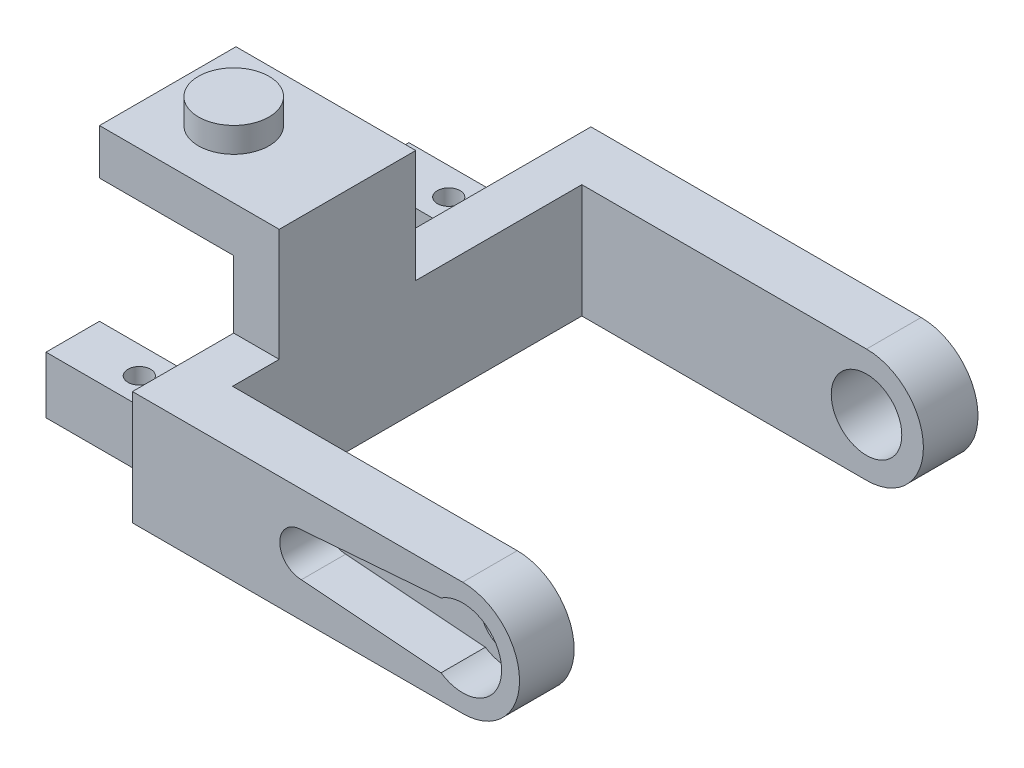
ISO-10303-21;
HEADER;
FILE_DESCRIPTION(('STEP AP214'),'2;1');
FILE_NAME('part.step','',(''),(''),'','','');
FILE_SCHEMA(('AUTOMOTIVE_DESIGN { 1 0 10303 214 1 1 1 1 }'));
ENDSEC;
DATA;
#1=APPLICATION_CONTEXT('core data for automotive mechanical design processes');
#2=APPLICATION_PROTOCOL_DEFINITION('international standard','automotive_design',2000,#1);
#3=PRODUCT_CONTEXT('',#1,'mechanical');
#4=PRODUCT('Part','Part','',(#3));
#5=PRODUCT_RELATED_PRODUCT_CATEGORY('part','',(#4));
#6=PRODUCT_DEFINITION_FORMATION('','',#4);
#7=PRODUCT_DEFINITION_CONTEXT('part definition',#1,'design');
#8=PRODUCT_DEFINITION('design','',#6,#7);
#9=PRODUCT_DEFINITION_SHAPE('','',#8);
#10=(LENGTH_UNIT() NAMED_UNIT(*) SI_UNIT(.MILLI.,.METRE.));
#11=(NAMED_UNIT(*) PLANE_ANGLE_UNIT() SI_UNIT($,.RADIAN.));
#12=(NAMED_UNIT(*) SI_UNIT($,.STERADIAN.) SOLID_ANGLE_UNIT());
#13=UNCERTAINTY_MEASURE_WITH_UNIT(LENGTH_MEASURE(1.E-05),#10,'distance_accuracy_value','');
#14=(GEOMETRIC_REPRESENTATION_CONTEXT(3) GLOBAL_UNCERTAINTY_ASSIGNED_CONTEXT((#13)) GLOBAL_UNIT_ASSIGNED_CONTEXT((#10,
#11,#12)) REPRESENTATION_CONTEXT('',''));
#15=CARTESIAN_POINT('',(0.,0.,0.));
#16=DIRECTION('',(0.,0.,1.));
#17=DIRECTION('',(1.,0.,0.));
#18=AXIS2_PLACEMENT_3D('',#15,#16,#17);
#19=CARTESIAN_POINT('',(-27.0232558139535,5.00000000000001,20.15));
#20=DIRECTION('',(0.,-1.,0.));
#21=DIRECTION('',(1.,0.,0.));
#22=AXIS2_PLACEMENT_3D('',#19,#20,#21);
#23=PLANE('',#22);
#24=DIRECTION('',(1.,0.,0.));
#25=VECTOR('',#24,1.);
#26=CARTESIAN_POINT('',(-2.,5.00000000000001,11.25));
#27=LINE('',#26,#25);
#28=CARTESIAN_POINT('',(-2.,5.00000000000001,11.25));
#29=VERTEX_POINT('',#28);
#30=CARTESIAN_POINT('',(2.,5.00000000000001,11.25));
#31=VERTEX_POINT('',#30);
#32=EDGE_CURVE('E558',#29,#31,#27,.T.);
#33=ORIENTED_EDGE('',*,*,#32,.F.);
#34=DIRECTION('',(0.,0.,1.));
#35=VECTOR('',#34,1.);
#36=CARTESIAN_POINT('',(-2.00000000000001,5.00000000000001,20.15));
#37=LINE('',#36,#35);
#38=CARTESIAN_POINT('',(-2.,5.00000000000002,20.15));
#39=VERTEX_POINT('',#38);
#40=EDGE_CURVE('E414',#29,#39,#37,.T.);
#41=ORIENTED_EDGE('',*,*,#40,.T.);
#42=DIRECTION('',(-1.,0.,0.));
#43=VECTOR('',#42,1.);
#44=CARTESIAN_POINT('',(-27.0232558139535,5.00000000000001,20.15));
#45=LINE('',#44,#43);
#46=CARTESIAN_POINT('',(27.0232558139535,5.00000000000002,20.15));
#47=VERTEX_POINT('',#46);
#48=EDGE_CURVE('E456',#47,#39,#45,.T.);
#49=ORIENTED_EDGE('',*,*,#48,.F.);
#50=DIRECTION('',(0.,0.,-1.));
#51=VECTOR('',#50,1.);
#52=CARTESIAN_POINT('',(27.0232558139535,5.00000000000002,20.15));
#53=LINE('',#52,#51);
#54=CARTESIAN_POINT('',(27.0232558139535,5.00000000000002,15.35));
#55=VERTEX_POINT('',#54);
#56=EDGE_CURVE('E471',#47,#55,#53,.T.);
#57=ORIENTED_EDGE('',*,*,#56,.T.);
#58=DIRECTION('',(-1.,0.,0.));
#59=VECTOR('',#58,1.);
#60=CARTESIAN_POINT('',(-27.0232558139535,5.00000000000001,15.35));
#61=LINE('',#60,#59);
#62=CARTESIAN_POINT('',(2.,5.00000000000001,15.35));
#63=VERTEX_POINT('',#62);
#64=EDGE_CURVE('E49',#55,#63,#61,.T.);
#65=ORIENTED_EDGE('',*,*,#64,.T.);
#66=DIRECTION('',(0.,0.,-1.));
#67=VECTOR('',#66,1.);
#68=CARTESIAN_POINT('',(1.99999999999999,5.00000000000001,20.15));
#69=LINE('',#68,#67);
#70=EDGE_CURVE('E481',#63,#31,#69,.T.);
#71=ORIENTED_EDGE('',*,*,#70,.T.);
#72=EDGE_LOOP('',(#33,#41,#49,#57,#65,#71));
#73=FACE_BOUND('',#72,.T.);
#74=ADVANCED_FACE('F39',(#73),#23,.F.);
#75=DIRECTION('',(-1.,0.,0.));
#76=VECTOR('',#75,1.);
#77=CARTESIAN_POINT('',(-2.,5.00000000000001,-0.750000000000002));
#78=LINE('',#77,#76);
#79=CARTESIAN_POINT('',(2.,5.00000000000001,-0.750000000000002));
#80=VERTEX_POINT('',#79);
#81=CARTESIAN_POINT('',(-2.,5.00000000000001,-0.750000000000001));
#82=VERTEX_POINT('',#81);
#83=EDGE_CURVE('E237',#80,#82,#78,.T.);
#84=ORIENTED_EDGE('',*,*,#83,.F.);
#85=CARTESIAN_POINT('',(2.,5.00000000000001,-15.35));
#86=VERTEX_POINT('',#85);
#87=EDGE_CURVE('E480',#80,#86,#69,.T.);
#88=ORIENTED_EDGE('',*,*,#87,.T.);
#89=DIRECTION('',(1.,0.,0.));
#90=VECTOR('',#89,1.);
#91=CARTESIAN_POINT('',(-27.0232558139535,5.00000000000001,-15.35));
#92=LINE('',#91,#90);
#93=CARTESIAN_POINT('',(27.0232558139535,5.00000000000002,-15.35));
#94=VERTEX_POINT('',#93);
#95=EDGE_CURVE('E11',#86,#94,#92,.T.);
#96=ORIENTED_EDGE('',*,*,#95,.T.);
#97=CARTESIAN_POINT('',(27.0232558139535,5.00000000000002,-20.15));
#98=VERTEX_POINT('',#97);
#99=EDGE_CURVE('E460',#94,#98,#53,.T.);
#100=ORIENTED_EDGE('',*,*,#99,.T.);
#101=DIRECTION('',(-1.,0.,0.));
#102=VECTOR('',#101,1.);
#103=CARTESIAN_POINT('',(-27.0232558139535,5.00000000000001,-20.15));
#104=LINE('',#103,#102);
#105=CARTESIAN_POINT('',(-2.,5.00000000000001,-20.15));
#106=VERTEX_POINT('',#105);
#107=EDGE_CURVE('E453',#98,#106,#104,.T.);
#108=ORIENTED_EDGE('',*,*,#107,.T.);
#109=EDGE_CURVE('E437',#106,#82,#37,.T.);
#110=ORIENTED_EDGE('',*,*,#109,.T.);
#111=EDGE_LOOP('',(#84,#88,#96,#100,#108,#110));
#112=FACE_BOUND('',#111,.T.);
#113=ADVANCED_FACE('F515',(#112),#23,.F.);
#114=CARTESIAN_POINT('',(27.0232558139535,0.,20.15));
#115=DIRECTION('',(0.,0.,-1.));
#116=DIRECTION('',(-1.,0.,0.));
#117=AXIS2_PLACEMENT_3D('',#114,#115,#116);
#118=CYLINDRICAL_SURFACE('',#117,5.00000000000002);
#119=ORIENTED_EDGE('',*,*,#99,.F.);
#120=CARTESIAN_POINT('',(27.0232558139535,0.,-15.35));
#121=DIRECTION('',(0.,0.,-1.));
#122=DIRECTION('',(-1.,0.,0.));
#123=AXIS2_PLACEMENT_3D('',#120,#121,#122);
#124=CIRCLE('',#123,5.00000000000002);
#125=CARTESIAN_POINT('',(27.0232558139535,-5.00000000000003,-15.35));
#126=VERTEX_POINT('',#125);
#127=EDGE_CURVE('E444',#94,#126,#124,.T.);
#128=ORIENTED_EDGE('',*,*,#127,.T.);
#129=DIRECTION('',(0.,0.,-1.));
#130=VECTOR('',#129,1.);
#131=CARTESIAN_POINT('',(27.0232558139535,-5.00000000000002,20.15));
#132=LINE('',#131,#130);
#133=CARTESIAN_POINT('',(27.0232558139535,-5.00000000000002,-20.15));
#134=VERTEX_POINT('',#133);
#135=EDGE_CURVE('E475',#126,#134,#132,.T.);
#136=ORIENTED_EDGE('',*,*,#135,.T.);
#137=CARTESIAN_POINT('',(27.0232558139535,0.,-20.15));
#138=DIRECTION('',(0.,0.,1.));
#139=DIRECTION('',(1.,0.,0.));
#140=AXIS2_PLACEMENT_3D('',#137,#138,#139);
#141=CIRCLE('',#140,5.00000000000002);
#142=EDGE_CURVE('E464',#134,#98,#141,.T.);
#143=ORIENTED_EDGE('',*,*,#142,.T.);
#144=EDGE_LOOP('',(#119,#128,#136,#143));
#145=FACE_BOUND('',#144,.T.);
#146=ADVANCED_FACE('F521',(#145),#118,.T.);
#147=CARTESIAN_POINT('',(-27.0232558139535,-5.00000000000002,20.15));
#148=DIRECTION('',(0.,1.,0.));
#149=DIRECTION('',(-1.,0.,0.));
#150=AXIS2_PLACEMENT_3D('',#147,#148,#149);
#151=PLANE('',#150);
#152=DIRECTION('',(1.,0.,0.));
#153=VECTOR('',#152,1.);
#154=CARTESIAN_POINT('',(-27.0232558139535,-5.00000000000002,20.15));
#155=LINE('',#154,#153);
#156=CARTESIAN_POINT('',(-2.,-5.00000000000003,20.15));
#157=VERTEX_POINT('',#156);
#158=CARTESIAN_POINT('',(27.0232558139535,-5.00000000000002,20.15));
#159=VERTEX_POINT('',#158);
#160=EDGE_CURVE('E449',#157,#159,#155,.T.);
#161=ORIENTED_EDGE('',*,*,#160,.F.);
#162=DIRECTION('',(0.,0.,-1.));
#163=VECTOR('',#162,1.);
#164=CARTESIAN_POINT('',(-2.,-5.00000000000003,20.15));
#165=LINE('',#164,#163);
#166=CARTESIAN_POINT('',(-1.99999999999999,-5.00000000000002,15.95));
#167=VERTEX_POINT('',#166);
#168=EDGE_CURVE('E403',#157,#167,#165,.T.);
#169=ORIENTED_EDGE('',*,*,#168,.T.);
#170=DIRECTION('',(-1.,0.,0.));
#171=VECTOR('',#170,1.);
#172=CARTESIAN_POINT('',(-2.,-5.00000000000002,15.95));
#173=LINE('',#172,#171);
#174=CARTESIAN_POINT('',(-13.8,-5.00000000000002,15.95));
#175=VERTEX_POINT('',#174);
#176=EDGE_CURVE('E257',#167,#175,#173,.T.);
#177=ORIENTED_EDGE('',*,*,#176,.T.);
#178=DIRECTION('',(0.,0.,-1.));
#179=VECTOR('',#178,1.);
#180=CARTESIAN_POINT('',(-13.8,-5.00000000000002,15.95));
#181=LINE('',#180,#179);
#182=CARTESIAN_POINT('',(-13.8,-5.00000000000002,11.25));
#183=VERTEX_POINT('',#182);
#184=EDGE_CURVE('E261',#175,#183,#181,.T.);
#185=ORIENTED_EDGE('',*,*,#184,.T.);
#186=DIRECTION('',(1.,0.,0.));
#187=VECTOR('',#186,1.);
#188=CARTESIAN_POINT('',(-13.8,-5.00000000000002,11.25));
#189=LINE('',#188,#187);
#190=CARTESIAN_POINT('',(-2.,-5.00000000000003,11.25));
#191=VERTEX_POINT('',#190);
#192=EDGE_CURVE('E262',#183,#191,#189,.T.);
#193=ORIENTED_EDGE('',*,*,#192,.T.);
#194=CARTESIAN_POINT('',(-2.,-5.00000000000003,-11.25));
#195=VERTEX_POINT('',#194);
#196=EDGE_CURVE('E408',#191,#195,#165,.T.);
#197=ORIENTED_EDGE('',*,*,#196,.T.);
#198=DIRECTION('',(-1.,0.,0.));
#199=VECTOR('',#198,1.);
#200=CARTESIAN_POINT('',(-13.8,-5.00000000000002,-11.25));
#201=LINE('',#200,#199);
#202=CARTESIAN_POINT('',(-13.8,-5.00000000000002,-11.25));
#203=VERTEX_POINT('',#202);
#204=EDGE_CURVE('E308',#195,#203,#201,.T.);
#205=ORIENTED_EDGE('',*,*,#204,.T.);
#206=DIRECTION('',(0.,0.,-1.));
#207=VECTOR('',#206,1.);
#208=CARTESIAN_POINT('',(-13.8,-5.00000000000002,-15.95));
#209=LINE('',#208,#207);
#210=CARTESIAN_POINT('',(-13.8,-5.00000000000002,-15.95));
#211=VERTEX_POINT('',#210);
#212=EDGE_CURVE('E309',#203,#211,#209,.T.);
#213=ORIENTED_EDGE('',*,*,#212,.T.);
#214=DIRECTION('',(1.,0.,0.));
#215=VECTOR('',#214,1.);
#216=CARTESIAN_POINT('',(-2.,-5.00000000000002,-15.95));
#217=LINE('',#216,#215);
#218=CARTESIAN_POINT('',(-2.,-5.00000000000003,-15.95));
#219=VERTEX_POINT('',#218);
#220=EDGE_CURVE('E303',#211,#219,#217,.T.);
#221=ORIENTED_EDGE('',*,*,#220,.T.);
#222=CARTESIAN_POINT('',(-2.,-5.00000000000003,-20.15));
#223=VERTEX_POINT('',#222);
#224=EDGE_CURVE('E409',#219,#223,#165,.T.);
#225=ORIENTED_EDGE('',*,*,#224,.T.);
#226=DIRECTION('',(1.,0.,0.));
#227=VECTOR('',#226,1.);
#228=CARTESIAN_POINT('',(-27.0232558139535,-5.00000000000002,-20.15));
#229=LINE('',#228,#227);
#230=EDGE_CURVE('E448',#223,#134,#229,.T.);
#231=ORIENTED_EDGE('',*,*,#230,.T.);
#232=ORIENTED_EDGE('',*,*,#135,.F.);
#233=DIRECTION('',(-1.,0.,0.));
#234=VECTOR('',#233,1.);
#235=CARTESIAN_POINT('',(27.0232558139535,-5.00000000000003,-15.35));
#236=LINE('',#235,#234);
#237=CARTESIAN_POINT('',(2.,-5.00000000000003,-15.35));
#238=VERTEX_POINT('',#237);
#239=EDGE_CURVE('E393',#126,#238,#236,.T.);
#240=ORIENTED_EDGE('',*,*,#239,.T.);
#241=DIRECTION('',(0.,0.,1.));
#242=VECTOR('',#241,1.);
#243=CARTESIAN_POINT('',(2.,-5.00000000000003,-15.35));
#244=LINE('',#243,#242);
#245=CARTESIAN_POINT('',(2.,-5.00000000000003,15.35));
#246=VERTEX_POINT('',#245);
#247=EDGE_CURVE('E421',#238,#246,#244,.T.);
#248=ORIENTED_EDGE('',*,*,#247,.T.);
#249=DIRECTION('',(1.,0.,0.));
#250=VECTOR('',#249,1.);
#251=CARTESIAN_POINT('',(2.,-5.00000000000003,15.35));
#252=LINE('',#251,#250);
#253=CARTESIAN_POINT('',(27.0232558139535,-5.00000000000003,15.35));
#254=VERTEX_POINT('',#253);
#255=EDGE_CURVE('E425',#246,#254,#252,.T.);
#256=ORIENTED_EDGE('',*,*,#255,.T.);
#257=EDGE_CURVE('E476',#159,#254,#132,.T.);
#258=ORIENTED_EDGE('',*,*,#257,.F.);
#259=EDGE_LOOP('',(#161,#169,#177,#185,#193,#197,#205,#213,#221,#225,#231,#232,#240,#248,#256,#258));
#260=FACE_BOUND('',#259,.T.);
#261=CARTESIAN_POINT('',(-7.9,-5.00000000000002,-13.55));
#262=DIRECTION('',(0.,1.,0.));
#263=DIRECTION('',(-1.,0.,0.));
#264=AXIS2_PLACEMENT_3D('',#261,#262,#263);
#265=CIRCLE('',#264,1.);
#266=CARTESIAN_POINT('',(-8.9,-5.00000000000002,-13.55));
#267=VERTEX_POINT('',#266);
#268=EDGE_CURVE('E307',#267,#267,#265,.F.);
#269=ORIENTED_EDGE('',*,*,#268,.F.);
#270=EDGE_LOOP('',(#269));
#271=FACE_BOUND('',#270,.T.);
#272=CARTESIAN_POINT('',(-7.9,-5.00000000000002,13.65));
#273=DIRECTION('',(0.,1.,0.));
#274=DIRECTION('',(-1.,0.,0.));
#275=AXIS2_PLACEMENT_3D('',#272,#273,#274);
#276=CIRCLE('',#275,1.);
#277=CARTESIAN_POINT('',(-8.9,-5.00000000000002,13.65));
#278=VERTEX_POINT('',#277);
#279=EDGE_CURVE('E260',#278,#278,#276,.F.);
#280=ORIENTED_EDGE('',*,*,#279,.F.);
#281=EDGE_LOOP('',(#280));
#282=FACE_BOUND('',#281,.T.);
#283=ADVANCED_FACE('F41',(#260,#271,#282),#151,.F.);
#284=ORIENTED_EDGE('',*,*,#257,.T.);
#285=CARTESIAN_POINT('',(27.0232558139535,0.,15.35));
#286=DIRECTION('',(0.,0.,1.));
#287=DIRECTION('',(1.,0.,0.));
#288=AXIS2_PLACEMENT_3D('',#285,#286,#287);
#289=CIRCLE('',#288,5.00000000000002);
#290=EDGE_CURVE('E440',#254,#55,#289,.T.);
#291=ORIENTED_EDGE('',*,*,#290,.T.);
#292=ORIENTED_EDGE('',*,*,#56,.F.);
#293=CARTESIAN_POINT('',(27.0232558139535,0.,20.15));
#294=DIRECTION('',(0.,0.,1.));
#295=DIRECTION('',(1.,0.,0.));
#296=AXIS2_PLACEMENT_3D('',#293,#294,#295);
#297=CIRCLE('',#296,5.00000000000002);
#298=EDGE_CURVE('E452',#159,#47,#297,.T.);
#299=ORIENTED_EDGE('',*,*,#298,.F.);
#300=EDGE_LOOP('',(#284,#291,#292,#299));
#301=FACE_BOUND('',#300,.T.);
#302=ADVANCED_FACE('F526',(#301),#118,.T.);
#303=CARTESIAN_POINT('',(-27.0232558139535,0.,20.15));
#304=DIRECTION('',(0.,0.,1.));
#305=DIRECTION('',(1.,0.,0.));
#306=AXIS2_PLACEMENT_3D('',#303,#304,#305);
#307=PLANE('',#306);
#308=CARTESIAN_POINT('',(12.8482558139535,0.,20.15));
#309=DIRECTION('',(0.,0.,1.));
#310=DIRECTION('',(1.,0.,0.));
#311=AXIS2_PLACEMENT_3D('',#308,#309,#310);
#312=CIRCLE('',#311,1.9);
#313=CARTESIAN_POINT('',(12.8482558139535,1.9,20.15));
#314=VERTEX_POINT('',#313);
#315=CARTESIAN_POINT('',(12.8482558139535,-1.9,20.15));
#316=VERTEX_POINT('',#315);
#317=EDGE_CURVE('E357',#314,#316,#312,.T.);
#318=ORIENTED_EDGE('',*,*,#317,.F.);
#319=DIRECTION('',(-0.997018781415782,-0.0771592476906667,0.));
#320=VECTOR('',#319,1.);
#321=CARTESIAN_POINT('',(25.1237492990923,2.85,20.15));
#322=LINE('',#321,#320);
#323=CARTESIAN_POINT('',(25.1237492990923,2.85,20.15));
#324=VERTEX_POINT('',#323);
#325=EDGE_CURVE('E364',#324,#314,#322,.T.);
#326=ORIENTED_EDGE('',*,*,#325,.F.);
#327=CARTESIAN_POINT('',(27.0232558139535,0.,20.15));
#328=DIRECTION('',(0.,0.,1.));
#329=DIRECTION('',(1.,0.,0.));
#330=AXIS2_PLACEMENT_3D('',#327,#328,#329);
#331=CIRCLE('',#330,3.425);
#332=CARTESIAN_POINT('',(25.1237492990923,-2.85,20.15));
#333=VERTEX_POINT('',#332);
#334=EDGE_CURVE('E383',#333,#324,#331,.T.);
#335=ORIENTED_EDGE('',*,*,#334,.F.);
#336=DIRECTION('',(0.997018781415782,-0.0771592476906667,0.));
#337=VECTOR('',#336,1.);
#338=CARTESIAN_POINT('',(12.8482558139535,-1.9,20.15));
#339=LINE('',#338,#337);
#340=EDGE_CURVE('E379',#316,#333,#339,.T.);
#341=ORIENTED_EDGE('',*,*,#340,.F.);
#342=EDGE_LOOP('',(#318,#326,#335,#341));
#343=FACE_BOUND('',#342,.T.);
#344=DIRECTION('',(0.,1.,0.));
#345=VECTOR('',#344,1.);
#346=CARTESIAN_POINT('',(-2.,-5.00000000000003,20.15));
#347=LINE('',#346,#345);
#348=EDGE_CURVE('E407',#157,#39,#347,.T.);
#349=ORIENTED_EDGE('',*,*,#348,.F.);
#350=ORIENTED_EDGE('',*,*,#160,.T.);
#351=ORIENTED_EDGE('',*,*,#298,.T.);
#352=ORIENTED_EDGE('',*,*,#48,.T.);
#353=EDGE_LOOP('',(#349,#350,#351,#352));
#354=FACE_BOUND('',#353,.T.);
#355=ADVANCED_FACE('F528',(#343,#354),#307,.T.);
#356=CARTESIAN_POINT('',(-27.0232558139535,0.,-20.15));
#357=DIRECTION('',(0.,0.,1.));
#358=DIRECTION('',(1.,0.,0.));
#359=AXIS2_PLACEMENT_3D('',#356,#357,#358);
#360=PLANE('',#359);
#361=CARTESIAN_POINT('',(27.0232558139535,0.,-20.15));
#362=DIRECTION('',(0.,0.,1.));
#363=DIRECTION('',(1.,0.,0.));
#364=AXIS2_PLACEMENT_3D('',#361,#362,#363);
#365=CIRCLE('',#364,3.1);
#366=CARTESIAN_POINT('',(30.1232558139535,0.,-20.15));
#367=VERTEX_POINT('',#366);
#368=EDGE_CURVE('E349',#367,#367,#365,.T.);
#369=ORIENTED_EDGE('',*,*,#368,.T.);
#370=EDGE_LOOP('',(#369));
#371=FACE_BOUND('',#370,.T.);
#372=ORIENTED_EDGE('',*,*,#230,.F.);
#373=DIRECTION('',(0.,1.,0.));
#374=VECTOR('',#373,1.);
#375=CARTESIAN_POINT('',(-2.,-5.00000000000003,-20.15));
#376=LINE('',#375,#374);
#377=EDGE_CURVE('E410',#223,#106,#376,.T.);
#378=ORIENTED_EDGE('',*,*,#377,.T.);
#379=ORIENTED_EDGE('',*,*,#107,.F.);
#380=ORIENTED_EDGE('',*,*,#142,.F.);
#381=EDGE_LOOP('',(#372,#378,#379,#380));
#382=FACE_BOUND('',#381,.T.);
#383=ADVANCED_FACE('F524',(#371,#382),#360,.F.);
#384=CARTESIAN_POINT('',(-2.,-5.00000000000003,20.15));
#385=DIRECTION('',(1.,0.,0.));
#386=DIRECTION('',(0.,1.,0.));
#387=AXIS2_PLACEMENT_3D('',#384,#385,#386);
#388=PLANE('',#387);
#389=DIRECTION('',(0.,-1.,0.));
#390=VECTOR('',#389,1.);
#391=CARTESIAN_POINT('',(-2.,14.9,11.25));
#392=LINE('',#391,#390);
#393=CARTESIAN_POINT('',(-2.,10.9,11.25));
#394=VERTEX_POINT('',#393);
#395=EDGE_CURVE('E57',#394,#29,#392,.T.);
#396=ORIENTED_EDGE('',*,*,#395,.F.);
#397=DIRECTION('',(0.,0.,-1.));
#398=VECTOR('',#397,1.);
#399=CARTESIAN_POINT('',(-2.,10.9,-0.750000000000002));
#400=LINE('',#399,#398);
#401=CARTESIAN_POINT('',(-2.,10.9,-0.750000000000002));
#402=VERTEX_POINT('',#401);
#403=EDGE_CURVE('E221',#394,#402,#400,.T.);
#404=ORIENTED_EDGE('',*,*,#403,.T.);
#405=DIRECTION('',(0.,-1.,0.));
#406=VECTOR('',#405,1.);
#407=CARTESIAN_POINT('',(-2.,14.9,-0.750000000000002));
#408=LINE('',#407,#406);
#409=EDGE_CURVE('E65',#402,#82,#408,.T.);
#410=ORIENTED_EDGE('',*,*,#409,.T.);
#411=ORIENTED_EDGE('',*,*,#109,.F.);
#412=ORIENTED_EDGE('',*,*,#377,.F.);
#413=ORIENTED_EDGE('',*,*,#224,.F.);
#414=DIRECTION('',(0.,1.,0.));
#415=VECTOR('',#414,1.);
#416=CARTESIAN_POINT('',(-2.,-17.7015747055237,-15.95));
#417=LINE('',#416,#415);
#418=CARTESIAN_POINT('',(-2.,0.,-15.95));
#419=VERTEX_POINT('',#418);
#420=EDGE_CURVE('E334',#219,#419,#417,.T.);
#421=ORIENTED_EDGE('',*,*,#420,.T.);
#422=DIRECTION('',(0.,0.,-1.));
#423=VECTOR('',#422,1.);
#424=CARTESIAN_POINT('',(-2.,0.,-11.25));
#425=LINE('',#424,#423);
#426=CARTESIAN_POINT('',(-2.,0.,-11.25));
#427=VERTEX_POINT('',#426);
#428=EDGE_CURVE('E318',#427,#419,#425,.T.);
#429=ORIENTED_EDGE('',*,*,#428,.F.);
#430=DIRECTION('',(0.,1.,0.));
#431=VECTOR('',#430,1.);
#432=CARTESIAN_POINT('',(-2.,-17.7015747055237,-11.25));
#433=LINE('',#432,#431);
#434=EDGE_CURVE('E312',#195,#427,#433,.T.);
#435=ORIENTED_EDGE('',*,*,#434,.F.);
#436=ORIENTED_EDGE('',*,*,#196,.F.);
#437=DIRECTION('',(0.,1.,0.));
#438=VECTOR('',#437,1.);
#439=CARTESIAN_POINT('',(-2.,-17.7015747055237,11.25));
#440=LINE('',#439,#438);
#441=CARTESIAN_POINT('',(-2.,0.,11.25));
#442=VERTEX_POINT('',#441);
#443=EDGE_CURVE('E290',#191,#442,#440,.T.);
#444=ORIENTED_EDGE('',*,*,#443,.T.);
#445=DIRECTION('',(0.,0.,-1.));
#446=VECTOR('',#445,1.);
#447=CARTESIAN_POINT('',(-2.,0.,11.25));
#448=LINE('',#447,#446);
#449=CARTESIAN_POINT('',(-1.99999999999999,0.,15.95));
#450=VERTEX_POINT('',#449);
#451=EDGE_CURVE('E280',#450,#442,#448,.T.);
#452=ORIENTED_EDGE('',*,*,#451,.F.);
#453=DIRECTION('',(0.,1.,0.));
#454=VECTOR('',#453,1.);
#455=CARTESIAN_POINT('',(-1.99999999999999,-17.7015747055237,15.95));
#456=LINE('',#455,#454);
#457=EDGE_CURVE('E294',#167,#450,#456,.T.);
#458=ORIENTED_EDGE('',*,*,#457,.F.);
#459=ORIENTED_EDGE('',*,*,#168,.F.);
#460=ORIENTED_EDGE('',*,*,#348,.T.);
#461=ORIENTED_EDGE('',*,*,#40,.F.);
#462=EDGE_LOOP('',(#396,#404,#410,#411,#412,#413,#421,#429,#435,#436,#444,#452,#458,#459,#460,#461));
#463=FACE_BOUND('',#462,.T.);
#464=ADVANCED_FACE('F228',(#463),#388,.F.);
#465=CARTESIAN_POINT('',(27.0232558139535,-5.00000000000003,-15.35));
#466=DIRECTION('',(0.,0.,-1.));
#467=DIRECTION('',(-1.,0.,0.));
#468=AXIS2_PLACEMENT_3D('',#465,#466,#467);
#469=PLANE('',#468);
#470=CARTESIAN_POINT('',(27.0232558139535,0.,-15.35));
#471=DIRECTION('',(0.,0.,-1.));
#472=DIRECTION('',(-1.,0.,0.));
#473=AXIS2_PLACEMENT_3D('',#470,#471,#472);
#474=CIRCLE('',#473,3.1);
#475=CARTESIAN_POINT('',(23.9232558139535,0.,-15.35));
#476=VERTEX_POINT('',#475);
#477=EDGE_CURVE('E43',#476,#476,#474,.T.);
#478=ORIENTED_EDGE('',*,*,#477,.T.);
#479=EDGE_LOOP('',(#478));
#480=FACE_BOUND('',#479,.T.);
#481=ORIENTED_EDGE('',*,*,#95,.F.);
#482=DIRECTION('',(0.,1.,0.));
#483=VECTOR('',#482,1.);
#484=CARTESIAN_POINT('',(2.,-5.00000000000003,-15.35));
#485=LINE('',#484,#483);
#486=EDGE_CURVE('E429',#238,#86,#485,.T.);
#487=ORIENTED_EDGE('',*,*,#486,.F.);
#488=ORIENTED_EDGE('',*,*,#239,.F.);
#489=ORIENTED_EDGE('',*,*,#127,.F.);
#490=EDGE_LOOP('',(#481,#487,#488,#489));
#491=FACE_BOUND('',#490,.T.);
#492=ADVANCED_FACE('F494',(#480,#491),#469,.F.);
#493=CARTESIAN_POINT('',(27.0232558139535,-5.00000000000003,15.35));
#494=DIRECTION('',(0.,0.,1.));
#495=DIRECTION('',(1.,0.,0.));
#496=AXIS2_PLACEMENT_3D('',#493,#494,#495);
#497=PLANE('',#496);
#498=CARTESIAN_POINT('',(27.0232558139535,0.,15.35));
#499=DIRECTION('',(0.,0.,1.));
#500=DIRECTION('',(1.,0.,0.));
#501=AXIS2_PLACEMENT_3D('',#498,#499,#500);
#502=CIRCLE('',#501,2.3);
#503=CARTESIAN_POINT('',(29.3232558139535,0.,15.35));
#504=VERTEX_POINT('',#503);
#505=EDGE_CURVE('E353',#504,#504,#502,.F.);
#506=ORIENTED_EDGE('',*,*,#505,.F.);
#507=EDGE_LOOP('',(#506));
#508=FACE_BOUND('',#507,.T.);
#509=ORIENTED_EDGE('',*,*,#255,.F.);
#510=DIRECTION('',(0.,1.,0.));
#511=VECTOR('',#510,1.);
#512=CARTESIAN_POINT('',(2.,-5.00000000000003,15.35));
#513=LINE('',#512,#511);
#514=EDGE_CURVE('E430',#246,#63,#513,.T.);
#515=ORIENTED_EDGE('',*,*,#514,.T.);
#516=ORIENTED_EDGE('',*,*,#64,.F.);
#517=ORIENTED_EDGE('',*,*,#290,.F.);
#518=EDGE_LOOP('',(#509,#515,#516,#517));
#519=FACE_BOUND('',#518,.T.);
#520=ADVANCED_FACE('F569',(#508,#519),#497,.F.);
#521=CARTESIAN_POINT('',(2.,-5.00000000000003,-15.35));
#522=DIRECTION('',(-1.,0.,0.));
#523=DIRECTION('',(0.,-1.,0.));
#524=AXIS2_PLACEMENT_3D('',#521,#522,#523);
#525=PLANE('',#524);
#526=ORIENTED_EDGE('',*,*,#514,.F.);
#527=ORIENTED_EDGE('',*,*,#247,.F.);
#528=ORIENTED_EDGE('',*,*,#486,.T.);
#529=ORIENTED_EDGE('',*,*,#87,.F.);
#530=DIRECTION('',(0.,-1.,0.));
#531=VECTOR('',#530,1.);
#532=CARTESIAN_POINT('',(2.,14.9,-0.750000000000002));
#533=LINE('',#532,#531);
#534=CARTESIAN_POINT('',(2.,14.9,-0.750000000000002));
#535=VERTEX_POINT('',#534);
#536=EDGE_CURVE('E239',#535,#80,#533,.T.);
#537=ORIENTED_EDGE('',*,*,#536,.F.);
#538=DIRECTION('',(0.,0.,-1.));
#539=VECTOR('',#538,1.);
#540=CARTESIAN_POINT('',(2.,14.9,11.25));
#541=LINE('',#540,#539);
#542=CARTESIAN_POINT('',(2.,14.9,11.25));
#543=VERTEX_POINT('',#542);
#544=EDGE_CURVE('E246',#543,#535,#541,.T.);
#545=ORIENTED_EDGE('',*,*,#544,.F.);
#546=DIRECTION('',(0.,-1.,0.));
#547=VECTOR('',#546,1.);
#548=CARTESIAN_POINT('',(2.,14.9,11.25));
#549=LINE('',#548,#547);
#550=EDGE_CURVE('E244',#543,#31,#549,.T.);
#551=ORIENTED_EDGE('',*,*,#550,.T.);
#552=ORIENTED_EDGE('',*,*,#70,.F.);
#553=EDGE_LOOP('',(#526,#527,#528,#529,#537,#545,#551,#552));
#554=FACE_BOUND('',#553,.T.);
#555=ADVANCED_FACE('F563',(#554),#525,.F.);
#556=CARTESIAN_POINT('',(12.8482558139535,0.,16.25));
#557=DIRECTION('',(0.,0.,1.));
#558=DIRECTION('',(1.,0.,0.));
#559=AXIS2_PLACEMENT_3D('',#556,#557,#558);
#560=CYLINDRICAL_SURFACE('',#559,1.9);
#561=ORIENTED_EDGE('',*,*,#317,.T.);
#562=DIRECTION('',(0.,0.,1.));
#563=VECTOR('',#562,1.);
#564=CARTESIAN_POINT('',(12.8482558139535,-1.9,16.25));
#565=LINE('',#564,#563);
#566=CARTESIAN_POINT('',(12.8482558139535,-1.9,16.25));
#567=VERTEX_POINT('',#566);
#568=EDGE_CURVE('E376',#567,#316,#565,.T.);
#569=ORIENTED_EDGE('',*,*,#568,.F.);
#570=CARTESIAN_POINT('',(12.8482558139535,0.,16.25));
#571=DIRECTION('',(0.,0.,1.));
#572=DIRECTION('',(1.,0.,0.));
#573=AXIS2_PLACEMENT_3D('',#570,#571,#572);
#574=CIRCLE('',#573,1.9);
#575=CARTESIAN_POINT('',(12.8482558139535,1.9,16.25));
#576=VERTEX_POINT('',#575);
#577=EDGE_CURVE('E359',#576,#567,#574,.T.);
#578=ORIENTED_EDGE('',*,*,#577,.F.);
#579=DIRECTION('',(0.,0.,1.));
#580=VECTOR('',#579,1.);
#581=CARTESIAN_POINT('',(12.8482558139535,1.9,16.25));
#582=LINE('',#581,#580);
#583=EDGE_CURVE('E390',#576,#314,#582,.T.);
#584=ORIENTED_EDGE('',*,*,#583,.T.);
#585=EDGE_LOOP('',(#561,#569,#578,#584));
#586=FACE_BOUND('',#585,.T.);
#587=ADVANCED_FACE('F704',(#586),#560,.F.);
#588=CARTESIAN_POINT('',(25.1237492990923,2.85,16.25));
#589=DIRECTION('',(-0.0771592476906667,0.997018781415782,0.));
#590=DIRECTION('',(-0.997018781415782,-0.0771592476906667,0.));
#591=AXIS2_PLACEMENT_3D('',#588,#589,#590);
#592=PLANE('',#591);
#593=ORIENTED_EDGE('',*,*,#325,.T.);
#594=ORIENTED_EDGE('',*,*,#583,.F.);
#595=DIRECTION('',(-0.997018781415782,-0.0771592476906667,0.));
#596=VECTOR('',#595,1.);
#597=CARTESIAN_POINT('',(25.1237492990923,2.85,16.25));
#598=LINE('',#597,#596);
#599=CARTESIAN_POINT('',(25.1237492990923,2.85,16.25));
#600=VERTEX_POINT('',#599);
#601=EDGE_CURVE('E372',#600,#576,#598,.T.);
#602=ORIENTED_EDGE('',*,*,#601,.F.);
#603=DIRECTION('',(0.,0.,1.));
#604=VECTOR('',#603,1.);
#605=CARTESIAN_POINT('',(25.1237492990923,2.85,16.25));
#606=LINE('',#605,#604);
#607=EDGE_CURVE('E394',#600,#324,#606,.T.);
#608=ORIENTED_EDGE('',*,*,#607,.T.);
#609=EDGE_LOOP('',(#593,#594,#602,#608));
#610=FACE_BOUND('',#609,.T.);
#611=ADVANCED_FACE('F897',(#610),#592,.F.);
#612=CARTESIAN_POINT('',(27.0232558139535,0.,16.25));
#613=DIRECTION('',(0.,0.,1.));
#614=DIRECTION('',(1.,0.,0.));
#615=AXIS2_PLACEMENT_3D('',#612,#613,#614);
#616=CYLINDRICAL_SURFACE('',#615,3.425);
#617=ORIENTED_EDGE('',*,*,#334,.T.);
#618=ORIENTED_EDGE('',*,*,#607,.F.);
#619=CARTESIAN_POINT('',(27.0232558139535,0.,16.25));
#620=DIRECTION('',(0.,0.,1.));
#621=DIRECTION('',(1.,0.,0.));
#622=AXIS2_PLACEMENT_3D('',#619,#620,#621);
#623=CIRCLE('',#622,3.425);
#624=CARTESIAN_POINT('',(25.1237492990923,-2.85,16.25));
#625=VERTEX_POINT('',#624);
#626=EDGE_CURVE('E368',#625,#600,#623,.T.);
#627=ORIENTED_EDGE('',*,*,#626,.F.);
#628=DIRECTION('',(0.,0.,1.));
#629=VECTOR('',#628,1.);
#630=CARTESIAN_POINT('',(25.1237492990923,-2.85,16.25));
#631=LINE('',#630,#629);
#632=EDGE_CURVE('E397',#625,#333,#631,.T.);
#633=ORIENTED_EDGE('',*,*,#632,.T.);
#634=EDGE_LOOP('',(#617,#618,#627,#633));
#635=FACE_BOUND('',#634,.T.);
#636=ADVANCED_FACE('F906',(#635),#616,.F.);
#637=CARTESIAN_POINT('',(12.8482558139535,-1.9,16.25));
#638=DIRECTION('',(-0.0771592476906667,-0.997018781415782,0.));
#639=DIRECTION('',(0.997018781415782,-0.0771592476906667,0.));
#640=AXIS2_PLACEMENT_3D('',#637,#638,#639);
#641=PLANE('',#640);
#642=ORIENTED_EDGE('',*,*,#340,.T.);
#643=ORIENTED_EDGE('',*,*,#632,.F.);
#644=DIRECTION('',(0.997018781415782,-0.0771592476906667,0.));
#645=VECTOR('',#644,1.);
#646=CARTESIAN_POINT('',(12.8482558139535,-1.9,16.25));
#647=LINE('',#646,#645);
#648=EDGE_CURVE('E363',#567,#625,#647,.T.);
#649=ORIENTED_EDGE('',*,*,#648,.F.);
#650=ORIENTED_EDGE('',*,*,#568,.T.);
#651=EDGE_LOOP('',(#642,#643,#649,#650));
#652=FACE_BOUND('',#651,.T.);
#653=ADVANCED_FACE('F845',(#652),#641,.F.);
#654=CARTESIAN_POINT('',(12.8482558139535,0.,16.25));
#655=DIRECTION('',(0.,0.,1.));
#656=DIRECTION('',(1.,0.,0.));
#657=AXIS2_PLACEMENT_3D('',#654,#655,#656);
#658=PLANE('',#657);
#659=CARTESIAN_POINT('',(27.0232558139535,0.,16.25));
#660=DIRECTION('',(0.,0.,1.));
#661=DIRECTION('',(1.,0.,0.));
#662=AXIS2_PLACEMENT_3D('',#659,#660,#661);
#663=CIRCLE('',#662,2.3);
#664=CARTESIAN_POINT('',(29.3232558139535,0.,16.25));
#665=VERTEX_POINT('',#664);
#666=EDGE_CURVE('E358',#665,#665,#663,.F.);
#667=ORIENTED_EDGE('',*,*,#666,.T.);
#668=EDGE_LOOP('',(#667));
#669=FACE_BOUND('',#668,.T.);
#670=ORIENTED_EDGE('',*,*,#577,.T.);
#671=ORIENTED_EDGE('',*,*,#648,.T.);
#672=ORIENTED_EDGE('',*,*,#626,.T.);
#673=ORIENTED_EDGE('',*,*,#601,.T.);
#674=EDGE_LOOP('',(#670,#671,#672,#673));
#675=FACE_BOUND('',#674,.T.);
#676=ADVANCED_FACE('F510',(#669,#675),#658,.T.);
#677=CARTESIAN_POINT('',(27.0232558139535,0.,20.15));
#678=DIRECTION('',(0.,0.,-1.));
#679=DIRECTION('',(-1.,0.,0.));
#680=AXIS2_PLACEMENT_3D('',#677,#678,#679);
#681=CYLINDRICAL_SURFACE('',#680,2.3);
#682=ORIENTED_EDGE('',*,*,#666,.F.);
#683=EDGE_LOOP('',(#682));
#684=FACE_BOUND('',#683,.T.);
#685=ORIENTED_EDGE('',*,*,#505,.T.);
#686=EDGE_LOOP('',(#685));
#687=FACE_BOUND('',#686,.T.);
#688=ADVANCED_FACE('F500',(#684,#687),#681,.F.);
#689=CARTESIAN_POINT('',(27.0232558139535,0.,-20.15));
#690=DIRECTION('',(0.,0.,1.));
#691=DIRECTION('',(1.,0.,0.));
#692=AXIS2_PLACEMENT_3D('',#689,#690,#691);
#693=CYLINDRICAL_SURFACE('',#692,3.1);
#694=ORIENTED_EDGE('',*,*,#368,.F.);
#695=EDGE_LOOP('',(#694));
#696=FACE_BOUND('',#695,.T.);
#697=ORIENTED_EDGE('',*,*,#477,.F.);
#698=EDGE_LOOP('',(#697));
#699=FACE_BOUND('',#698,.T.);
#700=ADVANCED_FACE('F497',(#696,#699),#693,.F.);
#701=CARTESIAN_POINT('',(-2.,-17.7015747055237,-15.95));
#702=DIRECTION('',(0.,0.,-1.));
#703=DIRECTION('',(-1.,0.,0.));
#704=AXIS2_PLACEMENT_3D('',#701,#702,#703);
#705=PLANE('',#704);
#706=ORIENTED_EDGE('',*,*,#220,.F.);
#707=DIRECTION('',(0.,1.,0.));
#708=VECTOR('',#707,1.);
#709=CARTESIAN_POINT('',(-13.8,-17.7015747055237,-15.95));
#710=LINE('',#709,#708);
#711=CARTESIAN_POINT('',(-13.8,0.,-15.95));
#712=VERTEX_POINT('',#711);
#713=EDGE_CURVE('E341',#211,#712,#710,.T.);
#714=ORIENTED_EDGE('',*,*,#713,.T.);
#715=DIRECTION('',(-1.,0.,0.));
#716=VECTOR('',#715,1.);
#717=CARTESIAN_POINT('',(-2.,0.,-15.95));
#718=LINE('',#717,#716);
#719=EDGE_CURVE('E322',#419,#712,#718,.T.);
#720=ORIENTED_EDGE('',*,*,#719,.F.);
#721=ORIENTED_EDGE('',*,*,#420,.F.);
#722=EDGE_LOOP('',(#706,#714,#720,#721));
#723=FACE_BOUND('',#722,.T.);
#724=ADVANCED_FACE('F499',(#723),#705,.T.);
#725=CARTESIAN_POINT('',(-13.8,-17.7015747055237,-15.95));
#726=DIRECTION('',(-1.,0.,0.));
#727=DIRECTION('',(0.,0.,1.));
#728=AXIS2_PLACEMENT_3D('',#725,#726,#727);
#729=PLANE('',#728);
#730=ORIENTED_EDGE('',*,*,#212,.F.);
#731=DIRECTION('',(0.,1.,0.));
#732=VECTOR('',#731,1.);
#733=CARTESIAN_POINT('',(-13.8,-17.7015747055237,-11.25));
#734=LINE('',#733,#732);
#735=CARTESIAN_POINT('',(-13.8,0.,-11.25));
#736=VERTEX_POINT('',#735);
#737=EDGE_CURVE('E338',#203,#736,#734,.T.);
#738=ORIENTED_EDGE('',*,*,#737,.T.);
#739=DIRECTION('',(0.,0.,1.));
#740=VECTOR('',#739,1.);
#741=CARTESIAN_POINT('',(-13.8,0.,-15.95));
#742=LINE('',#741,#740);
#743=EDGE_CURVE('E326',#712,#736,#742,.T.);
#744=ORIENTED_EDGE('',*,*,#743,.F.);
#745=ORIENTED_EDGE('',*,*,#713,.F.);
#746=EDGE_LOOP('',(#730,#738,#744,#745));
#747=FACE_BOUND('',#746,.T.);
#748=ADVANCED_FACE('F507',(#747),#729,.T.);
#749=CARTESIAN_POINT('',(-13.8,-17.7015747055237,-11.25));
#750=DIRECTION('',(0.,0.,1.));
#751=DIRECTION('',(1.,0.,0.));
#752=AXIS2_PLACEMENT_3D('',#749,#750,#751);
#753=PLANE('',#752);
#754=ORIENTED_EDGE('',*,*,#204,.F.);
#755=ORIENTED_EDGE('',*,*,#434,.T.);
#756=DIRECTION('',(1.,0.,0.));
#757=VECTOR('',#756,1.);
#758=CARTESIAN_POINT('',(-13.8,0.,-11.25));
#759=LINE('',#758,#757);
#760=EDGE_CURVE('E330',#736,#427,#759,.T.);
#761=ORIENTED_EDGE('',*,*,#760,.F.);
#762=ORIENTED_EDGE('',*,*,#737,.F.);
#763=EDGE_LOOP('',(#754,#755,#761,#762));
#764=FACE_BOUND('',#763,.T.);
#765=ADVANCED_FACE('F603',(#764),#753,.T.);
#766=CARTESIAN_POINT('',(0.,0.,0.));
#767=DIRECTION('',(0.,1.,0.));
#768=DIRECTION('',(0.,0.,1.));
#769=AXIS2_PLACEMENT_3D('',#766,#767,#768);
#770=PLANE('',#769);
#771=CARTESIAN_POINT('',(-7.9,0.,-13.55));
#772=DIRECTION('',(0.,1.,0.));
#773=DIRECTION('',(0.,0.,1.));
#774=AXIS2_PLACEMENT_3D('',#771,#772,#773);
#775=CIRCLE('',#774,1.);
#776=CARTESIAN_POINT('',(-7.9,0.,-12.55));
#777=VERTEX_POINT('',#776);
#778=EDGE_CURVE('E302',#777,#777,#775,.T.);
#779=ORIENTED_EDGE('',*,*,#778,.F.);
#780=EDGE_LOOP('',(#779));
#781=FACE_BOUND('',#780,.T.);
#782=ORIENTED_EDGE('',*,*,#428,.T.);
#783=ORIENTED_EDGE('',*,*,#719,.T.);
#784=ORIENTED_EDGE('',*,*,#743,.T.);
#785=ORIENTED_EDGE('',*,*,#760,.T.);
#786=EDGE_LOOP('',(#782,#783,#784,#785));
#787=FACE_BOUND('',#786,.T.);
#788=ADVANCED_FACE('F605',(#781,#787),#770,.T.);
#789=CARTESIAN_POINT('',(-7.9,-17.7015747055237,-13.55));
#790=DIRECTION('',(0.,1.,0.));
#791=DIRECTION('',(0.,0.,1.));
#792=AXIS2_PLACEMENT_3D('',#789,#790,#791);
#793=CYLINDRICAL_SURFACE('',#792,1.);
#794=ORIENTED_EDGE('',*,*,#268,.T.);
#795=EDGE_LOOP('',(#794));
#796=FACE_BOUND('',#795,.T.);
#797=ORIENTED_EDGE('',*,*,#778,.T.);
#798=EDGE_LOOP('',(#797));
#799=FACE_BOUND('',#798,.T.);
#800=ADVANCED_FACE('F608',(#796,#799),#793,.F.);
#801=CARTESIAN_POINT('',(-1.99999999999999,-17.7015747055237,15.95));
#802=DIRECTION('',(0.,0.,1.));
#803=DIRECTION('',(1.,0.,0.));
#804=AXIS2_PLACEMENT_3D('',#801,#802,#803);
#805=PLANE('',#804);
#806=ORIENTED_EDGE('',*,*,#176,.F.);
#807=ORIENTED_EDGE('',*,*,#457,.T.);
#808=DIRECTION('',(1.,0.,0.));
#809=VECTOR('',#808,1.);
#810=CARTESIAN_POINT('',(-1.99999999999999,0.,15.95));
#811=LINE('',#810,#809);
#812=CARTESIAN_POINT('',(-13.8,0.,15.95));
#813=VERTEX_POINT('',#812);
#814=EDGE_CURVE('E276',#813,#450,#811,.T.);
#815=ORIENTED_EDGE('',*,*,#814,.F.);
#816=DIRECTION('',(0.,1.,0.));
#817=VECTOR('',#816,1.);
#818=CARTESIAN_POINT('',(-13.8,-17.7015747055237,15.95));
#819=LINE('',#818,#817);
#820=EDGE_CURVE('E287',#175,#813,#819,.T.);
#821=ORIENTED_EDGE('',*,*,#820,.F.);
#822=EDGE_LOOP('',(#806,#807,#815,#821));
#823=FACE_BOUND('',#822,.T.);
#824=ADVANCED_FACE('F581',(#823),#805,.T.);
#825=CARTESIAN_POINT('',(-13.8,-17.7015747055237,11.25));
#826=DIRECTION('',(0.,0.,-1.));
#827=DIRECTION('',(-1.,0.,0.));
#828=AXIS2_PLACEMENT_3D('',#825,#826,#827);
#829=PLANE('',#828);
#830=ORIENTED_EDGE('',*,*,#192,.F.);
#831=DIRECTION('',(0.,1.,0.));
#832=VECTOR('',#831,1.);
#833=CARTESIAN_POINT('',(-13.8,-17.7015747055237,11.25));
#834=LINE('',#833,#832);
#835=CARTESIAN_POINT('',(-13.8,0.,11.25));
#836=VERTEX_POINT('',#835);
#837=EDGE_CURVE('E266',#183,#836,#834,.T.);
#838=ORIENTED_EDGE('',*,*,#837,.T.);
#839=DIRECTION('',(-1.,0.,0.));
#840=VECTOR('',#839,1.);
#841=CARTESIAN_POINT('',(-13.8,0.,11.25));
#842=LINE('',#841,#840);
#843=EDGE_CURVE('E283',#442,#836,#842,.T.);
#844=ORIENTED_EDGE('',*,*,#843,.F.);
#845=ORIENTED_EDGE('',*,*,#443,.F.);
#846=EDGE_LOOP('',(#830,#838,#844,#845));
#847=FACE_BOUND('',#846,.T.);
#848=ADVANCED_FACE('F593',(#847),#829,.T.);
#849=CARTESIAN_POINT('',(-13.8,-17.7015747055237,15.95));
#850=DIRECTION('',(-1.,0.,0.));
#851=DIRECTION('',(0.,0.,1.));
#852=AXIS2_PLACEMENT_3D('',#849,#850,#851);
#853=PLANE('',#852);
#854=ORIENTED_EDGE('',*,*,#184,.F.);
#855=ORIENTED_EDGE('',*,*,#820,.T.);
#856=DIRECTION('',(0.,0.,1.));
#857=VECTOR('',#856,1.);
#858=CARTESIAN_POINT('',(-13.8,0.,15.95));
#859=LINE('',#858,#857);
#860=EDGE_CURVE('E272',#836,#813,#859,.T.);
#861=ORIENTED_EDGE('',*,*,#860,.F.);
#862=ORIENTED_EDGE('',*,*,#837,.F.);
#863=EDGE_LOOP('',(#854,#855,#861,#862));
#864=FACE_BOUND('',#863,.T.);
#865=ADVANCED_FACE('F589',(#864),#853,.T.);
#866=CARTESIAN_POINT('',(0.,0.,0.));
#867=DIRECTION('',(0.,-1.,0.));
#868=DIRECTION('',(0.,0.,-1.));
#869=AXIS2_PLACEMENT_3D('',#866,#867,#868);
#870=PLANE('',#869);
#871=CARTESIAN_POINT('',(-7.9,0.,13.65));
#872=DIRECTION('',(0.,1.,0.));
#873=DIRECTION('',(0.,0.,1.));
#874=AXIS2_PLACEMENT_3D('',#871,#872,#873);
#875=CIRCLE('',#874,1.);
#876=CARTESIAN_POINT('',(-7.9,0.,14.65));
#877=VERTEX_POINT('',#876);
#878=EDGE_CURVE('E256',#877,#877,#875,.T.);
#879=ORIENTED_EDGE('',*,*,#878,.F.);
#880=EDGE_LOOP('',(#879));
#881=FACE_BOUND('',#880,.T.);
#882=ORIENTED_EDGE('',*,*,#860,.T.);
#883=ORIENTED_EDGE('',*,*,#814,.T.);
#884=ORIENTED_EDGE('',*,*,#451,.T.);
#885=ORIENTED_EDGE('',*,*,#843,.T.);
#886=EDGE_LOOP('',(#882,#883,#884,#885));
#887=FACE_BOUND('',#886,.T.);
#888=ADVANCED_FACE('F584',(#881,#887),#870,.F.);
#889=CARTESIAN_POINT('',(-7.9,-17.7015747055237,13.65));
#890=DIRECTION('',(0.,1.,0.));
#891=DIRECTION('',(0.,0.,1.));
#892=AXIS2_PLACEMENT_3D('',#889,#890,#891);
#893=CYLINDRICAL_SURFACE('',#892,1.);
#894=ORIENTED_EDGE('',*,*,#279,.T.);
#895=EDGE_LOOP('',(#894));
#896=FACE_BOUND('',#895,.T.);
#897=ORIENTED_EDGE('',*,*,#878,.T.);
#898=EDGE_LOOP('',(#897));
#899=FACE_BOUND('',#898,.T.);
#900=ADVANCED_FACE('F672',(#896,#899),#893,.F.);
#901=CARTESIAN_POINT('',(-2.,14.9,11.25));
#902=DIRECTION('',(0.,0.,-1.));
#903=DIRECTION('',(-1.,0.,0.));
#904=AXIS2_PLACEMENT_3D('',#901,#902,#903);
#905=PLANE('',#904);
#906=ORIENTED_EDGE('',*,*,#32,.T.);
#907=ORIENTED_EDGE('',*,*,#550,.F.);
#908=DIRECTION('',(1.,0.,0.));
#909=VECTOR('',#908,1.);
#910=CARTESIAN_POINT('',(-2.,14.9,11.25));
#911=LINE('',#910,#909);
#912=CARTESIAN_POINT('',(-13.8,14.9,11.25));
#913=VERTEX_POINT('',#912);
#914=EDGE_CURVE('E557',#913,#543,#911,.T.);
#915=ORIENTED_EDGE('',*,*,#914,.F.);
#916=DIRECTION('',(0.,1.,0.));
#917=VECTOR('',#916,1.);
#918=CARTESIAN_POINT('',(-13.8,10.9,11.25));
#919=LINE('',#918,#917);
#920=CARTESIAN_POINT('',(-13.8,10.9,11.25));
#921=VERTEX_POINT('',#920);
#922=EDGE_CURVE('E806',#921,#913,#919,.T.);
#923=ORIENTED_EDGE('',*,*,#922,.F.);
#924=DIRECTION('',(1.,0.,0.));
#925=VECTOR('',#924,1.);
#926=CARTESIAN_POINT('',(-2.,10.9,11.25));
#927=LINE('',#926,#925);
#928=EDGE_CURVE('E802',#921,#394,#927,.T.);
#929=ORIENTED_EDGE('',*,*,#928,.T.);
#930=ORIENTED_EDGE('',*,*,#395,.T.);
#931=EDGE_LOOP('',(#906,#907,#915,#923,#929,#930));
#932=FACE_BOUND('',#931,.T.);
#933=ADVANCED_FACE('F681',(#932),#905,.F.);
#934=CARTESIAN_POINT('',(-2.,14.9,-0.750000000000002));
#935=DIRECTION('',(0.,0.,1.));
#936=DIRECTION('',(1.,0.,0.));
#937=AXIS2_PLACEMENT_3D('',#934,#935,#936);
#938=PLANE('',#937);
#939=ORIENTED_EDGE('',*,*,#83,.T.);
#940=ORIENTED_EDGE('',*,*,#409,.F.);
#941=DIRECTION('',(-1.,0.,0.));
#942=VECTOR('',#941,1.);
#943=CARTESIAN_POINT('',(-2.,10.9,-0.750000000000002));
#944=LINE('',#943,#942);
#945=CARTESIAN_POINT('',(-13.8,10.9,-0.750000000000001));
#946=VERTEX_POINT('',#945);
#947=EDGE_CURVE('E218',#402,#946,#944,.T.);
#948=ORIENTED_EDGE('',*,*,#947,.T.);
#949=DIRECTION('',(0.,1.,0.));
#950=VECTOR('',#949,1.);
#951=CARTESIAN_POINT('',(-13.8,10.9,-0.750000000000001));
#952=LINE('',#951,#950);
#953=CARTESIAN_POINT('',(-13.8,14.9,-0.750000000000001));
#954=VERTEX_POINT('',#953);
#955=EDGE_CURVE('E804',#946,#954,#952,.T.);
#956=ORIENTED_EDGE('',*,*,#955,.T.);
#957=DIRECTION('',(-1.,0.,0.));
#958=VECTOR('',#957,1.);
#959=CARTESIAN_POINT('',(-2.,14.9,-0.750000000000002));
#960=LINE('',#959,#958);
#961=EDGE_CURVE('E240',#535,#954,#960,.T.);
#962=ORIENTED_EDGE('',*,*,#961,.F.);
#963=ORIENTED_EDGE('',*,*,#536,.T.);
#964=EDGE_LOOP('',(#939,#940,#948,#956,#962,#963));
#965=FACE_BOUND('',#964,.T.);
#966=ADVANCED_FACE('F234',(#965),#938,.F.);
#967=CARTESIAN_POINT('',(0.,14.9,0.));
#968=DIRECTION('',(0.,1.,0.));
#969=DIRECTION('',(0.,0.,1.));
#970=AXIS2_PLACEMENT_3D('',#967,#968,#969);
#971=PLANE('',#970);
#972=CARTESIAN_POINT('',(-7.89915248150105,14.9,5.35));
#973=DIRECTION('',(0.,1.,0.));
#974=DIRECTION('',(0.,0.,1.));
#975=AXIS2_PLACEMENT_3D('',#972,#973,#974);
#976=CIRCLE('',#975,3.1);
#977=CARTESIAN_POINT('',(-7.89915248150105,14.9,8.45));
#978=VERTEX_POINT('',#977);
#979=EDGE_CURVE('E791',#978,#978,#976,.T.);
#980=ORIENTED_EDGE('',*,*,#979,.F.);
#981=EDGE_LOOP('',(#980));
#982=FACE_BOUND('',#981,.T.);
#983=ORIENTED_EDGE('',*,*,#961,.T.);
#984=DIRECTION('',(0.,0.,1.));
#985=VECTOR('',#984,1.);
#986=CARTESIAN_POINT('',(-13.8,14.9,-0.750000000000001));
#987=LINE('',#986,#985);
#988=EDGE_CURVE('E231',#954,#913,#987,.T.);
#989=ORIENTED_EDGE('',*,*,#988,.T.);
#990=ORIENTED_EDGE('',*,*,#914,.T.);
#991=ORIENTED_EDGE('',*,*,#544,.T.);
#992=EDGE_LOOP('',(#983,#989,#990,#991));
#993=FACE_BOUND('',#992,.T.);
#994=ADVANCED_FACE('F735',(#982,#993),#971,.T.);
#995=CARTESIAN_POINT('',(-13.8,10.9,-0.750000000000001));
#996=DIRECTION('',(-1.,0.,0.));
#997=DIRECTION('',(0.,0.,1.));
#998=AXIS2_PLACEMENT_3D('',#995,#996,#997);
#999=PLANE('',#998);
#1000=ORIENTED_EDGE('',*,*,#988,.F.);
#1001=ORIENTED_EDGE('',*,*,#955,.F.);
#1002=DIRECTION('',(0.,0.,1.));
#1003=VECTOR('',#1002,1.);
#1004=CARTESIAN_POINT('',(-13.8,10.9,-0.750000000000001));
#1005=LINE('',#1004,#1003);
#1006=EDGE_CURVE('E223',#946,#921,#1005,.T.);
#1007=ORIENTED_EDGE('',*,*,#1006,.T.);
#1008=ORIENTED_EDGE('',*,*,#922,.T.);
#1009=EDGE_LOOP('',(#1000,#1001,#1007,#1008));
#1010=FACE_BOUND('',#1009,.T.);
#1011=ADVANCED_FACE('F743',(#1010),#999,.T.);
#1012=CARTESIAN_POINT('',(0.,10.9,0.));
#1013=DIRECTION('',(0.,-1.,0.));
#1014=DIRECTION('',(0.,0.,-1.));
#1015=AXIS2_PLACEMENT_3D('',#1012,#1013,#1014);
#1016=PLANE('',#1015);
#1017=ORIENTED_EDGE('',*,*,#403,.F.);
#1018=ORIENTED_EDGE('',*,*,#928,.F.);
#1019=ORIENTED_EDGE('',*,*,#1006,.F.);
#1020=ORIENTED_EDGE('',*,*,#947,.F.);
#1021=EDGE_LOOP('',(#1017,#1018,#1019,#1020));
#1022=FACE_BOUND('',#1021,.T.);
#1023=ADVANCED_FACE('F219',(#1022),#1016,.T.);
#1024=CARTESIAN_POINT('',(-7.89915248150105,17.1,5.35));
#1025=DIRECTION('',(0.,-1.,0.));
#1026=DIRECTION('',(0.,0.,-1.));
#1027=AXIS2_PLACEMENT_3D('',#1024,#1025,#1026);
#1028=CYLINDRICAL_SURFACE('',#1027,3.1);
#1029=CARTESIAN_POINT('',(-7.89915248150105,17.1,5.35));
#1030=DIRECTION('',(0.,1.,0.));
#1031=DIRECTION('',(0.,0.,1.));
#1032=AXIS2_PLACEMENT_3D('',#1029,#1030,#1031);
#1033=CIRCLE('',#1032,3.1);
#1034=CARTESIAN_POINT('',(-7.89915248150105,17.1,8.45));
#1035=VERTEX_POINT('',#1034);
#1036=EDGE_CURVE('E789',#1035,#1035,#1033,.T.);
#1037=ORIENTED_EDGE('',*,*,#1036,.F.);
#1038=EDGE_LOOP('',(#1037));
#1039=FACE_BOUND('',#1038,.T.);
#1040=ORIENTED_EDGE('',*,*,#979,.T.);
#1041=EDGE_LOOP('',(#1040));
#1042=FACE_BOUND('',#1041,.T.);
#1043=ADVANCED_FACE('F757',(#1039,#1042),#1028,.T.);
#1044=CARTESIAN_POINT('',(-7.89915248150105,17.1,5.35));
#1045=DIRECTION('',(0.,1.,0.));
#1046=DIRECTION('',(0.,0.,1.));
#1047=AXIS2_PLACEMENT_3D('',#1044,#1045,#1046);
#1048=PLANE('',#1047);
#1049=ORIENTED_EDGE('',*,*,#1036,.T.);
#1050=EDGE_LOOP('',(#1049));
#1051=FACE_BOUND('',#1050,.T.);
#1052=ADVANCED_FACE('F773',(#1051),#1048,.T.);
#1053=CLOSED_SHELL('',(#74,#113,#146,#283,#302,#355,#383,#464,#492,#520,#555,#587,#611,#636,
#653,#676,#688,#700,#724,#748,#765,#788,#800,#824,#848,#865,#888,#900,#933,#966,#994,#1011,
#1023,#1043,#1052));
#1054=MANIFOLD_SOLID_BREP('B2',#1053);
#1055=ADVANCED_BREP_SHAPE_REPRESENTATION('',(#18,#1054),#14);
#1056=SHAPE_DEFINITION_REPRESENTATION(#9,#1055);
ENDSEC;
END-ISO-10303-21;
